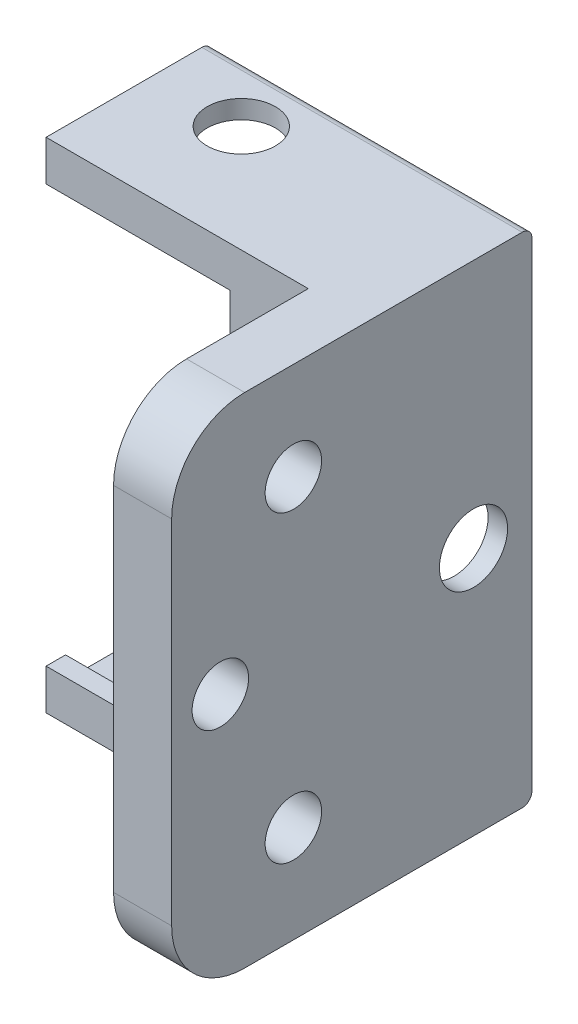
ISO-10303-21;
HEADER;
FILE_DESCRIPTION(('STEP AP214'),'2;1');
FILE_NAME('part.step','',(''),(''),'','','');
FILE_SCHEMA(('AUTOMOTIVE_DESIGN { 1 0 10303 214 1 1 1 1 }'));
ENDSEC;
DATA;
#1=APPLICATION_CONTEXT('core data for automotive mechanical design processes');
#2=APPLICATION_PROTOCOL_DEFINITION('international standard','automotive_design',2000,#1);
#3=PRODUCT_CONTEXT('',#1,'mechanical');
#4=PRODUCT('Part','Part','',(#3));
#5=PRODUCT_RELATED_PRODUCT_CATEGORY('part','',(#4));
#6=PRODUCT_DEFINITION_FORMATION('','',#4);
#7=PRODUCT_DEFINITION_CONTEXT('part definition',#1,'design');
#8=PRODUCT_DEFINITION('design','',#6,#7);
#9=PRODUCT_DEFINITION_SHAPE('','',#8);
#10=(LENGTH_UNIT() NAMED_UNIT(*) SI_UNIT(.MILLI.,.METRE.));
#11=(NAMED_UNIT(*) PLANE_ANGLE_UNIT() SI_UNIT($,.RADIAN.));
#12=(NAMED_UNIT(*) SI_UNIT($,.STERADIAN.) SOLID_ANGLE_UNIT());
#13=UNCERTAINTY_MEASURE_WITH_UNIT(LENGTH_MEASURE(1.E-05),#10,'distance_accuracy_value','');
#14=(GEOMETRIC_REPRESENTATION_CONTEXT(3) GLOBAL_UNCERTAINTY_ASSIGNED_CONTEXT((#13)) GLOBAL_UNIT_ASSIGNED_CONTEXT((#10,
#11,#12)) REPRESENTATION_CONTEXT('',''));
#15=CARTESIAN_POINT('',(0.,0.,0.));
#16=DIRECTION('',(0.,0.,1.));
#17=DIRECTION('',(1.,0.,0.));
#18=AXIS2_PLACEMENT_3D('',#15,#16,#17);
#19=CARTESIAN_POINT('',(0.,21.4398169336384,2.));
#20=DIRECTION('',(0.,-1.,0.));
#21=DIRECTION('',(0.,0.,-1.));
#22=AXIS2_PLACEMENT_3D('',#19,#20,#21);
#23=PLANE('',#22);
#24=DIRECTION('',(0.,0.,1.));
#25=VECTOR('',#24,1.);
#26=CARTESIAN_POINT('',(-9.0471071903977,21.4398169336384,2.));
#27=LINE('',#26,#25);
#28=CARTESIAN_POINT('',(-9.0471071903977,21.4398169336384,0.));
#29=VERTEX_POINT('',#28);
#30=CARTESIAN_POINT('',(-9.0471071903977,21.4398169336384,2.));
#31=VERTEX_POINT('',#30);
#32=EDGE_CURVE('E209',#29,#31,#27,.T.);
#33=ORIENTED_EDGE('',*,*,#32,.F.);
#34=DIRECTION('',(-1.,0.,0.));
#35=VECTOR('',#34,1.);
#36=CARTESIAN_POINT('',(0.,21.4398169336384,0.));
#37=LINE('',#36,#35);
#38=CARTESIAN_POINT('',(9.85000000000001,21.4398169336384,0.));
#39=VERTEX_POINT('',#38);
#40=EDGE_CURVE('E266',#39,#29,#37,.T.);
#41=ORIENTED_EDGE('',*,*,#40,.F.);
#42=DIRECTION('',(0.,0.,-1.));
#43=VECTOR('',#42,1.);
#44=CARTESIAN_POINT('',(9.85000000000001,21.4398169336384,2.));
#45=LINE('',#44,#43);
#46=CARTESIAN_POINT('',(9.85000000000001,21.4398169336384,2.));
#47=VERTEX_POINT('',#46);
#48=EDGE_CURVE('E286',#47,#39,#45,.T.);
#49=ORIENTED_EDGE('',*,*,#48,.F.);
#50=DIRECTION('',(-1.,0.,0.));
#51=VECTOR('',#50,1.);
#52=CARTESIAN_POINT('',(0.,21.4398169336384,2.));
#53=LINE('',#52,#51);
#54=EDGE_CURVE('E268',#47,#31,#53,.T.);
#55=ORIENTED_EDGE('',*,*,#54,.T.);
#56=EDGE_LOOP('',(#33,#41,#49,#55));
#57=FACE_BOUND('',#56,.T.);
#58=ADVANCED_FACE('F33',(#57),#23,.T.);
#59=CARTESIAN_POINT('',(9.85000000000001,0.,2.));
#60=DIRECTION('',(1.,0.,0.));
#61=DIRECTION('',(0.,1.,0.));
#62=AXIS2_PLACEMENT_3D('',#59,#60,#61);
#63=PLANE('',#62);
#64=DIRECTION('',(0.,-1.,0.));
#65=VECTOR('',#64,1.);
#66=CARTESIAN_POINT('',(9.85000000000001,0.,0.));
#67=LINE('',#66,#65);
#68=CARTESIAN_POINT('',(9.85000000000001,-21.4398169336385,0.));
#69=VERTEX_POINT('',#68);
#70=EDGE_CURVE('E278',#39,#69,#67,.T.);
#71=ORIENTED_EDGE('',*,*,#70,.T.);
#72=DIRECTION('',(0.,0.,-1.));
#73=VECTOR('',#72,1.);
#74=CARTESIAN_POINT('',(9.85000000000001,-21.4398169336385,2.));
#75=LINE('',#74,#73);
#76=CARTESIAN_POINT('',(9.85000000000001,-21.4398169336385,2.));
#77=VERTEX_POINT('',#76);
#78=EDGE_CURVE('E276',#77,#69,#75,.T.);
#79=ORIENTED_EDGE('',*,*,#78,.F.);
#80=DIRECTION('',(0.,-1.,0.));
#81=VECTOR('',#80,1.);
#82=CARTESIAN_POINT('',(9.85000000000001,0.,2.));
#83=LINE('',#82,#81);
#84=EDGE_CURVE('E271',#47,#77,#83,.T.);
#85=ORIENTED_EDGE('',*,*,#84,.F.);
#86=ORIENTED_EDGE('',*,*,#48,.T.);
#87=EDGE_LOOP('',(#71,#79,#85,#86));
#88=FACE_BOUND('',#87,.T.);
#89=ADVANCED_FACE('F394',(#88),#63,.F.);
#90=CARTESIAN_POINT('',(0.,-21.4398169336385,2.));
#91=DIRECTION('',(0.,-1.,0.));
#92=DIRECTION('',(0.,0.,-1.));
#93=AXIS2_PLACEMENT_3D('',#90,#91,#92);
#94=PLANE('',#93);
#95=DIRECTION('',(-1.,0.,0.));
#96=VECTOR('',#95,1.);
#97=CARTESIAN_POINT('',(0.,-21.4398169336385,0.));
#98=LINE('',#97,#96);
#99=CARTESIAN_POINT('',(-9.0471071903977,-21.4398169336385,0.));
#100=VERTEX_POINT('',#99);
#101=EDGE_CURVE('E280',#69,#100,#98,.T.);
#102=ORIENTED_EDGE('',*,*,#101,.T.);
#103=DIRECTION('',(0.,0.,1.));
#104=VECTOR('',#103,1.);
#105=CARTESIAN_POINT('',(-9.0471071903977,-21.4398169336385,2.));
#106=LINE('',#105,#104);
#107=CARTESIAN_POINT('',(-9.0471071903977,-21.4398169336385,2.));
#108=VERTEX_POINT('',#107);
#109=EDGE_CURVE('E212',#100,#108,#106,.T.);
#110=ORIENTED_EDGE('',*,*,#109,.T.);
#111=DIRECTION('',(-1.,0.,0.));
#112=VECTOR('',#111,1.);
#113=CARTESIAN_POINT('',(0.,-21.4398169336385,2.));
#114=LINE('',#113,#112);
#115=EDGE_CURVE('E273',#77,#108,#114,.T.);
#116=ORIENTED_EDGE('',*,*,#115,.F.);
#117=ORIENTED_EDGE('',*,*,#78,.T.);
#118=EDGE_LOOP('',(#102,#110,#116,#117));
#119=FACE_BOUND('',#118,.T.);
#120=ADVANCED_FACE('F389',(#119),#94,.F.);
#121=CARTESIAN_POINT('',(0.,0.,2.));
#122=DIRECTION('',(0.,0.,1.));
#123=DIRECTION('',(1.,0.,0.));
#124=AXIS2_PLACEMENT_3D('',#121,#122,#123);
#125=PLANE('',#124);
#126=DIRECTION('',(0.,1.,0.));
#127=VECTOR('',#126,1.);
#128=CARTESIAN_POINT('',(-9.0471071903977,25.6,2.));
#129=LINE('',#128,#127);
#130=CARTESIAN_POINT('',(-9.0471071903977,-25.6,2.));
#131=VERTEX_POINT('',#130);
#132=EDGE_CURVE('E198',#131,#108,#129,.T.);
#133=ORIENTED_EDGE('',*,*,#132,.F.);
#134=DIRECTION('',(1.,0.,0.));
#135=VECTOR('',#134,1.);
#136=CARTESIAN_POINT('',(-23.85,-25.6,2.));
#137=LINE('',#136,#135);
#138=CARTESIAN_POINT('',(17.8809566709219,-25.6,2.));
#139=VERTEX_POINT('',#138);
#140=EDGE_CURVE('E260',#131,#139,#137,.T.);
#141=ORIENTED_EDGE('',*,*,#140,.T.);
#142=DIRECTION('',(0.,-1.,0.));
#143=VECTOR('',#142,1.);
#144=CARTESIAN_POINT('',(17.8809566709219,-25.6,2.));
#145=LINE('',#144,#143);
#146=CARTESIAN_POINT('',(17.8809566709219,25.6,2.));
#147=VERTEX_POINT('',#146);
#148=EDGE_CURVE('E231',#147,#139,#145,.T.);
#149=ORIENTED_EDGE('',*,*,#148,.F.);
#150=DIRECTION('',(-1.,0.,0.));
#151=VECTOR('',#150,1.);
#152=CARTESIAN_POINT('',(23.85,25.6,2.));
#153=LINE('',#152,#151);
#154=CARTESIAN_POINT('',(-9.0471071903977,25.6,2.));
#155=VERTEX_POINT('',#154);
#156=EDGE_CURVE('E168',#147,#155,#153,.T.);
#157=ORIENTED_EDGE('',*,*,#156,.T.);
#158=EDGE_CURVE('E194',#31,#155,#129,.T.);
#159=ORIENTED_EDGE('',*,*,#158,.F.);
#160=ORIENTED_EDGE('',*,*,#54,.F.);
#161=ORIENTED_EDGE('',*,*,#84,.T.);
#162=ORIENTED_EDGE('',*,*,#115,.T.);
#163=EDGE_LOOP('',(#133,#141,#149,#157,#159,#160,#161,#162));
#164=FACE_BOUND('',#163,.T.);
#165=ADVANCED_FACE('F362',(#164),#125,.T.);
#166=CARTESIAN_POINT('',(0.,0.,0.));
#167=DIRECTION('',(0.,0.,1.));
#168=DIRECTION('',(1.,0.,0.));
#169=AXIS2_PLACEMENT_3D('',#166,#167,#168);
#170=PLANE('',#169);
#171=DIRECTION('',(0.,1.,0.));
#172=VECTOR('',#171,1.);
#173=CARTESIAN_POINT('',(21.85,0.,0.));
#174=LINE('',#173,#172);
#175=CARTESIAN_POINT('',(21.85,-23.7,0.));
#176=VERTEX_POINT('',#175);
#177=CARTESIAN_POINT('',(21.85,23.7,0.));
#178=VERTEX_POINT('',#177);
#179=EDGE_CURVE('E180',#176,#178,#174,.T.);
#180=ORIENTED_EDGE('',*,*,#179,.F.);
#181=DIRECTION('',(-1.,0.,0.));
#182=VECTOR('',#181,1.);
#183=CARTESIAN_POINT('',(-13.548634531605,-23.7,0.));
#184=LINE('',#183,#182);
#185=CARTESIAN_POINT('',(-9.0471071903977,-23.7,0.));
#186=VERTEX_POINT('',#185);
#187=EDGE_CURVE('E177',#176,#186,#184,.T.);
#188=ORIENTED_EDGE('',*,*,#187,.T.);
#189=DIRECTION('',(0.,1.,0.));
#190=VECTOR('',#189,1.);
#191=CARTESIAN_POINT('',(-9.0471071903977,0.,0.));
#192=LINE('',#191,#190);
#193=EDGE_CURVE('E210',#186,#100,#192,.T.);
#194=ORIENTED_EDGE('',*,*,#193,.T.);
#195=ORIENTED_EDGE('',*,*,#101,.F.);
#196=ORIENTED_EDGE('',*,*,#70,.F.);
#197=ORIENTED_EDGE('',*,*,#40,.T.);
#198=CARTESIAN_POINT('',(-9.0471071903977,23.7,0.));
#199=VERTEX_POINT('',#198);
#200=EDGE_CURVE('E55',#29,#199,#192,.T.);
#201=ORIENTED_EDGE('',*,*,#200,.T.);
#202=DIRECTION('',(1.,0.,0.));
#203=VECTOR('',#202,1.);
#204=CARTESIAN_POINT('',(-13.548634531605,23.7,0.));
#205=LINE('',#204,#203);
#206=EDGE_CURVE('E182',#199,#178,#205,.T.);
#207=ORIENTED_EDGE('',*,*,#206,.T.);
#208=EDGE_LOOP('',(#180,#188,#194,#195,#196,#197,#201,#207));
#209=FACE_BOUND('',#208,.T.);
#210=ADVANCED_FACE('F384',(#209),#170,.F.);
#211=CARTESIAN_POINT('',(21.85,-23.6,-15.));
#212=DIRECTION('',(1.,0.,0.));
#213=DIRECTION('',(0.,0.,-1.));
#214=AXIS2_PLACEMENT_3D('',#211,#212,#213);
#215=PLANE('',#214);
#216=CARTESIAN_POINT('',(21.85,0.,-9.));
#217=DIRECTION('',(1.,0.,0.));
#218=DIRECTION('',(0.,0.,-1.));
#219=AXIS2_PLACEMENT_3D('',#216,#217,#218);
#220=CIRCLE('',#219,3.49999999999999);
#221=CARTESIAN_POINT('',(21.85,0.,-12.5));
#222=VERTEX_POINT('',#221);
#223=EDGE_CURVE('E248',#222,#222,#220,.T.);
#224=ORIENTED_EDGE('',*,*,#223,.T.);
#225=EDGE_LOOP('',(#224));
#226=FACE_BOUND('',#225,.T.);
#227=DIRECTION('',(0.,1.,0.));
#228=VECTOR('',#227,1.);
#229=CARTESIAN_POINT('',(21.85,-23.6,-15.));
#230=LINE('',#229,#228);
#231=CARTESIAN_POINT('',(21.85,-23.7,-15.));
#232=VERTEX_POINT('',#231);
#233=CARTESIAN_POINT('',(21.85,23.7,-15.));
#234=VERTEX_POINT('',#233);
#235=EDGE_CURVE('E159',#232,#234,#230,.T.);
#236=ORIENTED_EDGE('',*,*,#235,.F.);
#237=DIRECTION('',(0.,0.,-1.));
#238=VECTOR('',#237,1.);
#239=CARTESIAN_POINT('',(21.85,-23.7,59.1593046502588));
#240=LINE('',#239,#238);
#241=EDGE_CURVE('E181',#176,#232,#240,.T.);
#242=ORIENTED_EDGE('',*,*,#241,.F.);
#243=ORIENTED_EDGE('',*,*,#179,.T.);
#244=DIRECTION('',(0.,0.,-1.));
#245=VECTOR('',#244,1.);
#246=CARTESIAN_POINT('',(21.85,23.7,59.1593046502588));
#247=LINE('',#246,#245);
#248=EDGE_CURVE('E175',#178,#234,#247,.T.);
#249=ORIENTED_EDGE('',*,*,#248,.T.);
#250=EDGE_LOOP('',(#236,#242,#243,#249));
#251=FACE_BOUND('',#250,.T.);
#252=ADVANCED_FACE('F179',(#226,#251),#215,.F.);
#253=CARTESIAN_POINT('',(23.85,25.6,-15.));
#254=DIRECTION('',(0.,1.,0.));
#255=DIRECTION('',(-1.,0.,0.));
#256=AXIS2_PLACEMENT_3D('',#253,#254,#255);
#257=PLANE('',#256);
#258=DIRECTION('',(0.,0.,1.));
#259=VECTOR('',#258,1.);
#260=CARTESIAN_POINT('',(-9.0471071903977,25.6,-15.));
#261=LINE('',#260,#259);
#262=CARTESIAN_POINT('',(-9.0471071903977,25.6,-14.));
#263=VERTEX_POINT('',#262);
#264=EDGE_CURVE('E200',#263,#155,#261,.T.);
#265=ORIENTED_EDGE('',*,*,#264,.T.);
#266=ORIENTED_EDGE('',*,*,#156,.F.);
#267=DIRECTION('',(0.,0.,-1.));
#268=VECTOR('',#267,1.);
#269=CARTESIAN_POINT('',(17.8809566709219,25.6,22.));
#270=LINE('',#269,#268);
#271=CARTESIAN_POINT('',(17.8809566709219,25.6,14.5));
#272=VERTEX_POINT('',#271);
#273=EDGE_CURVE('E243',#272,#147,#270,.T.);
#274=ORIENTED_EDGE('',*,*,#273,.F.);
#275=DIRECTION('',(-1.,0.,0.));
#276=VECTOR('',#275,1.);
#277=CARTESIAN_POINT('',(23.85,25.6,14.5));
#278=LINE('',#277,#276);
#279=CARTESIAN_POINT('',(23.85,25.6,14.5));
#280=VERTEX_POINT('',#279);
#281=EDGE_CURVE('E300',#272,#280,#278,.F.);
#282=ORIENTED_EDGE('',*,*,#281,.T.);
#283=DIRECTION('',(0.,0.,1.));
#284=VECTOR('',#283,1.);
#285=CARTESIAN_POINT('',(23.85,25.6,-15.));
#286=LINE('',#285,#284);
#287=CARTESIAN_POINT('',(23.85,25.6,-14.));
#288=VERTEX_POINT('',#287);
#289=EDGE_CURVE('E264',#288,#280,#286,.T.);
#290=ORIENTED_EDGE('',*,*,#289,.F.);
#291=DIRECTION('',(-1.,0.,0.));
#292=VECTOR('',#291,1.);
#293=CARTESIAN_POINT('',(-23.85,25.6,-14.));
#294=LINE('',#293,#292);
#295=EDGE_CURVE('E310',#288,#263,#294,.T.);
#296=ORIENTED_EDGE('',*,*,#295,.T.);
#297=EDGE_LOOP('',(#265,#266,#274,#282,#290,#296));
#298=FACE_BOUND('',#297,.T.);
#299=CARTESIAN_POINT('',(0.,25.6,-9.));
#300=DIRECTION('',(0.,-1.,0.));
#301=DIRECTION('',(0.,0.,-1.));
#302=AXIS2_PLACEMENT_3D('',#299,#300,#301);
#303=CIRCLE('',#302,3.49999999999999);
#304=CARTESIAN_POINT('',(0.,25.6,-12.5));
#305=VERTEX_POINT('',#304);
#306=EDGE_CURVE('E169',#305,#305,#303,.T.);
#307=ORIENTED_EDGE('',*,*,#306,.T.);
#308=EDGE_LOOP('',(#307));
#309=FACE_BOUND('',#308,.T.);
#310=ADVANCED_FACE('F342',(#298,#309),#257,.T.);
#311=CARTESIAN_POINT('',(23.85,-25.6,-15.));
#312=DIRECTION('',(1.,0.,0.));
#313=DIRECTION('',(0.,0.,-1.));
#314=AXIS2_PLACEMENT_3D('',#311,#312,#313);
#315=PLANE('',#314);
#316=CARTESIAN_POINT('',(23.85,-15.6,9.5));
#317=DIRECTION('',(1.,0.,0.));
#318=DIRECTION('',(0.,0.,-1.));
#319=AXIS2_PLACEMENT_3D('',#316,#317,#318);
#320=CIRCLE('',#319,2.9);
#321=CARTESIAN_POINT('',(23.85,-15.6,6.6));
#322=VERTEX_POINT('',#321);
#323=EDGE_CURVE('E215',#322,#322,#320,.T.);
#324=ORIENTED_EDGE('',*,*,#323,.F.);
#325=EDGE_LOOP('',(#324));
#326=FACE_BOUND('',#325,.T.);
#327=CARTESIAN_POINT('',(23.85,15.6,9.5));
#328=DIRECTION('',(1.,0.,0.));
#329=DIRECTION('',(0.,0.,-1.));
#330=AXIS2_PLACEMENT_3D('',#327,#328,#329);
#331=CIRCLE('',#330,2.9);
#332=CARTESIAN_POINT('',(23.85,15.6,6.6));
#333=VERTEX_POINT('',#332);
#334=EDGE_CURVE('E219',#333,#333,#331,.T.);
#335=ORIENTED_EDGE('',*,*,#334,.F.);
#336=EDGE_LOOP('',(#335));
#337=FACE_BOUND('',#336,.T.);
#338=CARTESIAN_POINT('',(23.85,0.,17.));
#339=DIRECTION('',(1.,0.,0.));
#340=DIRECTION('',(0.,0.,-1.));
#341=AXIS2_PLACEMENT_3D('',#338,#339,#340);
#342=CIRCLE('',#341,2.9);
#343=CARTESIAN_POINT('',(23.85,0.,14.1));
#344=VERTEX_POINT('',#343);
#345=EDGE_CURVE('E225',#344,#344,#342,.T.);
#346=ORIENTED_EDGE('',*,*,#345,.F.);
#347=EDGE_LOOP('',(#346));
#348=FACE_BOUND('',#347,.T.);
#349=CARTESIAN_POINT('',(23.85,0.,-9.));
#350=DIRECTION('',(1.,0.,0.));
#351=DIRECTION('',(0.,0.,-1.));
#352=AXIS2_PLACEMENT_3D('',#349,#350,#351);
#353=CIRCLE('',#352,3.49999999999999);
#354=CARTESIAN_POINT('',(23.85,0.,-12.5));
#355=VERTEX_POINT('',#354);
#356=EDGE_CURVE('E245',#355,#355,#353,.T.);
#357=ORIENTED_EDGE('',*,*,#356,.F.);
#358=EDGE_LOOP('',(#357));
#359=FACE_BOUND('',#358,.T.);
#360=DIRECTION('',(0.,1.,0.));
#361=VECTOR('',#360,1.);
#362=CARTESIAN_POINT('',(23.85,-25.6,-15.));
#363=LINE('',#362,#361);
#364=CARTESIAN_POINT('',(23.85,-24.6,-15.));
#365=VERTEX_POINT('',#364);
#366=CARTESIAN_POINT('',(23.85,24.6,-15.));
#367=VERTEX_POINT('',#366);
#368=EDGE_CURVE('E256',#365,#367,#363,.T.);
#369=ORIENTED_EDGE('',*,*,#368,.T.);
#370=CARTESIAN_POINT('',(23.85,24.6,-14.));
#371=DIRECTION('',(1.,0.,0.));
#372=DIRECTION('',(0.,0.,-1.));
#373=AXIS2_PLACEMENT_3D('',#370,#371,#372);
#374=CIRCLE('',#373,1.);
#375=EDGE_CURVE('E320',#367,#288,#374,.T.);
#376=ORIENTED_EDGE('',*,*,#375,.T.);
#377=ORIENTED_EDGE('',*,*,#289,.T.);
#378=CARTESIAN_POINT('',(23.85,18.1,14.5));
#379=DIRECTION('',(1.,0.,0.));
#380=DIRECTION('',(0.,0.,-1.));
#381=AXIS2_PLACEMENT_3D('',#378,#379,#380);
#382=CIRCLE('',#381,7.5);
#383=CARTESIAN_POINT('',(23.85,18.1,22.));
#384=VERTEX_POINT('',#383);
#385=EDGE_CURVE('E306',#280,#384,#382,.T.);
#386=ORIENTED_EDGE('',*,*,#385,.T.);
#387=DIRECTION('',(0.,1.,0.));
#388=VECTOR('',#387,1.);
#389=CARTESIAN_POINT('',(23.85,-25.6,22.));
#390=LINE('',#389,#388);
#391=CARTESIAN_POINT('',(23.85,-18.1,22.));
#392=VERTEX_POINT('',#391);
#393=EDGE_CURVE('E232',#392,#384,#390,.T.);
#394=ORIENTED_EDGE('',*,*,#393,.F.);
#395=CARTESIAN_POINT('',(23.85,-18.1,14.5));
#396=DIRECTION('',(1.,0.,0.));
#397=DIRECTION('',(0.,0.,-1.));
#398=AXIS2_PLACEMENT_3D('',#395,#396,#397);
#399=CIRCLE('',#398,7.5);
#400=CARTESIAN_POINT('',(23.85,-25.6,14.5));
#401=VERTEX_POINT('',#400);
#402=EDGE_CURVE('E303',#392,#401,#399,.T.);
#403=ORIENTED_EDGE('',*,*,#402,.T.);
#404=DIRECTION('',(0.,0.,1.));
#405=VECTOR('',#404,1.);
#406=CARTESIAN_POINT('',(23.85,-25.6,-15.));
#407=LINE('',#406,#405);
#408=CARTESIAN_POINT('',(23.85,-25.6,-14.));
#409=VERTEX_POINT('',#408);
#410=EDGE_CURVE('E259',#409,#401,#407,.T.);
#411=ORIENTED_EDGE('',*,*,#410,.F.);
#412=CARTESIAN_POINT('',(23.85,-24.6,-14.));
#413=DIRECTION('',(1.,0.,0.));
#414=DIRECTION('',(0.,0.,-1.));
#415=AXIS2_PLACEMENT_3D('',#412,#413,#414);
#416=CIRCLE('',#415,1.);
#417=EDGE_CURVE('E318',#409,#365,#416,.T.);
#418=ORIENTED_EDGE('',*,*,#417,.T.);
#419=EDGE_LOOP('',(#369,#376,#377,#386,#394,#403,#411,#418));
#420=FACE_BOUND('',#419,.T.);
#421=ADVANCED_FACE('F335',(#326,#337,#348,#359,#420),#315,.T.);
#422=CARTESIAN_POINT('',(-23.85,-25.6,-15.));
#423=DIRECTION('',(0.,-1.,0.));
#424=DIRECTION('',(1.,0.,0.));
#425=AXIS2_PLACEMENT_3D('',#422,#423,#424);
#426=PLANE('',#425);
#427=DIRECTION('',(0.,0.,1.));
#428=VECTOR('',#427,1.);
#429=CARTESIAN_POINT('',(-9.0471071903977,-25.6,-15.));
#430=LINE('',#429,#428);
#431=CARTESIAN_POINT('',(-9.0471071903977,-25.6,-14.));
#432=VERTEX_POINT('',#431);
#433=EDGE_CURVE('E204',#432,#131,#430,.T.);
#434=ORIENTED_EDGE('',*,*,#433,.F.);
#435=DIRECTION('',(1.,0.,0.));
#436=VECTOR('',#435,1.);
#437=CARTESIAN_POINT('',(23.85,-25.6,-14.));
#438=LINE('',#437,#436);
#439=EDGE_CURVE('E322',#432,#409,#438,.T.);
#440=ORIENTED_EDGE('',*,*,#439,.T.);
#441=ORIENTED_EDGE('',*,*,#410,.T.);
#442=DIRECTION('',(1.,0.,0.));
#443=VECTOR('',#442,1.);
#444=CARTESIAN_POINT('',(-23.85,-25.6,14.5));
#445=LINE('',#444,#443);
#446=CARTESIAN_POINT('',(17.8809566709219,-25.6,14.5));
#447=VERTEX_POINT('',#446);
#448=EDGE_CURVE('E308',#401,#447,#445,.F.);
#449=ORIENTED_EDGE('',*,*,#448,.T.);
#450=DIRECTION('',(0.,0.,-1.));
#451=VECTOR('',#450,1.);
#452=CARTESIAN_POINT('',(17.8809566709219,-25.6,22.));
#453=LINE('',#452,#451);
#454=EDGE_CURVE('E238',#447,#139,#453,.T.);
#455=ORIENTED_EDGE('',*,*,#454,.T.);
#456=ORIENTED_EDGE('',*,*,#140,.F.);
#457=EDGE_LOOP('',(#434,#440,#441,#449,#455,#456));
#458=FACE_BOUND('',#457,.T.);
#459=CARTESIAN_POINT('',(0.,-25.6,-9.));
#460=DIRECTION('',(0.,-1.,0.));
#461=DIRECTION('',(0.,0.,-1.));
#462=AXIS2_PLACEMENT_3D('',#459,#460,#461);
#463=CIRCLE('',#462,3.49999999999999);
#464=CARTESIAN_POINT('',(0.,-25.6,-12.5));
#465=VERTEX_POINT('',#464);
#466=EDGE_CURVE('E251',#465,#465,#463,.T.);
#467=ORIENTED_EDGE('',*,*,#466,.F.);
#468=EDGE_LOOP('',(#467));
#469=FACE_BOUND('',#468,.T.);
#470=ADVANCED_FACE('F372',(#458,#469),#426,.T.);
#471=CARTESIAN_POINT('',(0.,0.,-15.));
#472=DIRECTION('',(0.,0.,1.));
#473=DIRECTION('',(1.,0.,0.));
#474=AXIS2_PLACEMENT_3D('',#471,#472,#473);
#475=PLANE('',#474);
#476=DIRECTION('',(0.,1.,0.));
#477=VECTOR('',#476,1.);
#478=CARTESIAN_POINT('',(-9.0471071903977,25.6,-15.));
#479=LINE('',#478,#477);
#480=CARTESIAN_POINT('',(-9.0471071903977,-24.6,-15.));
#481=VERTEX_POINT('',#480);
#482=CARTESIAN_POINT('',(-9.0471071903977,-23.7,-15.));
#483=VERTEX_POINT('',#482);
#484=EDGE_CURVE('E197',#481,#483,#479,.T.);
#485=ORIENTED_EDGE('',*,*,#484,.T.);
#486=DIRECTION('',(-1.,0.,0.));
#487=VECTOR('',#486,1.);
#488=CARTESIAN_POINT('',(-13.548634531605,-23.7,-15.));
#489=LINE('',#488,#487);
#490=EDGE_CURVE('E48',#232,#483,#489,.T.);
#491=ORIENTED_EDGE('',*,*,#490,.F.);
#492=ORIENTED_EDGE('',*,*,#235,.T.);
#493=DIRECTION('',(1.,0.,0.));
#494=VECTOR('',#493,1.);
#495=CARTESIAN_POINT('',(-13.548634531605,23.7,-15.));
#496=LINE('',#495,#494);
#497=CARTESIAN_POINT('',(-9.0471071903977,23.7,-15.));
#498=VERTEX_POINT('',#497);
#499=EDGE_CURVE('E163',#498,#234,#496,.T.);
#500=ORIENTED_EDGE('',*,*,#499,.F.);
#501=CARTESIAN_POINT('',(-9.0471071903977,24.6,-15.));
#502=VERTEX_POINT('',#501);
#503=EDGE_CURVE('E195',#498,#502,#479,.T.);
#504=ORIENTED_EDGE('',*,*,#503,.T.);
#505=DIRECTION('',(-1.,0.,0.));
#506=VECTOR('',#505,1.);
#507=CARTESIAN_POINT('',(23.85,24.6,-15.));
#508=LINE('',#507,#506);
#509=EDGE_CURVE('E316',#502,#367,#508,.F.);
#510=ORIENTED_EDGE('',*,*,#509,.T.);
#511=ORIENTED_EDGE('',*,*,#368,.F.);
#512=DIRECTION('',(1.,0.,0.));
#513=VECTOR('',#512,1.);
#514=CARTESIAN_POINT('',(-23.85,-24.6,-15.));
#515=LINE('',#514,#513);
#516=EDGE_CURVE('E313',#365,#481,#515,.F.);
#517=ORIENTED_EDGE('',*,*,#516,.T.);
#518=EDGE_LOOP('',(#485,#491,#492,#500,#504,#510,#511,#517));
#519=FACE_BOUND('',#518,.T.);
#520=ADVANCED_FACE('F162',(#519),#475,.F.);
#521=CARTESIAN_POINT('',(0.,-25.6,-9.));
#522=DIRECTION('',(0.,-1.,0.));
#523=DIRECTION('',(0.,0.,-1.));
#524=AXIS2_PLACEMENT_3D('',#521,#522,#523);
#525=CYLINDRICAL_SURFACE('',#524,3.49999999999999);
#526=CARTESIAN_POINT('',(0.,-23.7,-9.));
#527=DIRECTION('',(0.,-1.,0.));
#528=DIRECTION('',(0.,0.,-1.));
#529=AXIS2_PLACEMENT_3D('',#526,#527,#528);
#530=CIRCLE('',#529,3.49999999999999);
#531=CARTESIAN_POINT('',(0.,-23.7,-12.5));
#532=VERTEX_POINT('',#531);
#533=EDGE_CURVE('E191',#532,#532,#530,.F.);
#534=ORIENTED_EDGE('',*,*,#533,.T.);
#535=EDGE_LOOP('',(#534));
#536=FACE_BOUND('',#535,.T.);
#537=ORIENTED_EDGE('',*,*,#466,.T.);
#538=EDGE_LOOP('',(#537));
#539=FACE_BOUND('',#538,.T.);
#540=ADVANCED_FACE('F446',(#536,#539),#525,.F.);
#541=CARTESIAN_POINT('',(0.,23.7,-9.));
#542=DIRECTION('',(0.,1.,0.));
#543=DIRECTION('',(-1.,0.,0.));
#544=AXIS2_PLACEMENT_3D('',#541,#542,#543);
#545=CIRCLE('',#544,3.49999999999999);
#546=CARTESIAN_POINT('',(-3.49999999999999,23.7,-9.));
#547=VERTEX_POINT('',#546);
#548=EDGE_CURVE('E184',#547,#547,#545,.F.);
#549=ORIENTED_EDGE('',*,*,#548,.T.);
#550=EDGE_LOOP('',(#549));
#551=FACE_BOUND('',#550,.T.);
#552=ORIENTED_EDGE('',*,*,#306,.F.);
#553=EDGE_LOOP('',(#552));
#554=FACE_BOUND('',#553,.T.);
#555=ADVANCED_FACE('F442',(#551,#554),#525,.F.);
#556=CARTESIAN_POINT('',(23.85,0.,-9.));
#557=DIRECTION('',(1.,0.,0.));
#558=DIRECTION('',(0.,0.,-1.));
#559=AXIS2_PLACEMENT_3D('',#556,#557,#558);
#560=CYLINDRICAL_SURFACE('',#559,3.49999999999999);
#561=ORIENTED_EDGE('',*,*,#356,.T.);
#562=EDGE_LOOP('',(#561));
#563=FACE_BOUND('',#562,.T.);
#564=ORIENTED_EDGE('',*,*,#223,.F.);
#565=EDGE_LOOP('',(#564));
#566=FACE_BOUND('',#565,.T.);
#567=ADVANCED_FACE('F438',(#563,#566),#560,.F.);
#568=CARTESIAN_POINT('',(17.8809566709219,-25.6,22.));
#569=DIRECTION('',(1.,0.,0.));
#570=DIRECTION('',(0.,0.,-1.));
#571=AXIS2_PLACEMENT_3D('',#568,#569,#570);
#572=PLANE('',#571);
#573=CARTESIAN_POINT('',(17.8809566709219,-15.6,9.5));
#574=DIRECTION('',(1.,0.,0.));
#575=DIRECTION('',(0.,0.,-1.));
#576=AXIS2_PLACEMENT_3D('',#573,#574,#575);
#577=CIRCLE('',#576,2.9);
#578=CARTESIAN_POINT('',(17.8809566709219,-15.6,6.6));
#579=VERTEX_POINT('',#578);
#580=EDGE_CURVE('E218',#579,#579,#577,.T.);
#581=ORIENTED_EDGE('',*,*,#580,.T.);
#582=EDGE_LOOP('',(#581));
#583=FACE_BOUND('',#582,.T.);
#584=CARTESIAN_POINT('',(17.8809566709219,15.6,9.5));
#585=DIRECTION('',(1.,0.,0.));
#586=DIRECTION('',(0.,0.,-1.));
#587=AXIS2_PLACEMENT_3D('',#584,#585,#586);
#588=CIRCLE('',#587,2.9);
#589=CARTESIAN_POINT('',(17.8809566709219,15.6,6.60000000000001));
#590=VERTEX_POINT('',#589);
#591=EDGE_CURVE('E222',#590,#590,#588,.T.);
#592=ORIENTED_EDGE('',*,*,#591,.T.);
#593=EDGE_LOOP('',(#592));
#594=FACE_BOUND('',#593,.T.);
#595=CARTESIAN_POINT('',(17.8809566709219,0.,17.));
#596=DIRECTION('',(1.,0.,0.));
#597=DIRECTION('',(0.,0.,-1.));
#598=AXIS2_PLACEMENT_3D('',#595,#596,#597);
#599=CIRCLE('',#598,2.9);
#600=CARTESIAN_POINT('',(17.8809566709219,0.,14.1));
#601=VERTEX_POINT('',#600);
#602=EDGE_CURVE('E228',#601,#601,#599,.T.);
#603=ORIENTED_EDGE('',*,*,#602,.T.);
#604=EDGE_LOOP('',(#603));
#605=FACE_BOUND('',#604,.T.);
#606=DIRECTION('',(0.,-1.,0.));
#607=VECTOR('',#606,1.);
#608=CARTESIAN_POINT('',(17.8809566709219,-25.6,22.));
#609=LINE('',#608,#607);
#610=CARTESIAN_POINT('',(17.8809566709219,18.1,22.));
#611=VERTEX_POINT('',#610);
#612=CARTESIAN_POINT('',(17.8809566709219,-18.1,22.));
#613=VERTEX_POINT('',#612);
#614=EDGE_CURVE('E235',#611,#613,#609,.T.);
#615=ORIENTED_EDGE('',*,*,#614,.F.);
#616=CARTESIAN_POINT('',(17.8809566709219,18.1,14.5));
#617=DIRECTION('',(1.,0.,0.));
#618=DIRECTION('',(0.,0.,-1.));
#619=AXIS2_PLACEMENT_3D('',#616,#617,#618);
#620=CIRCLE('',#619,7.5);
#621=EDGE_CURVE('E298',#611,#272,#620,.F.);
#622=ORIENTED_EDGE('',*,*,#621,.T.);
#623=ORIENTED_EDGE('',*,*,#273,.T.);
#624=ORIENTED_EDGE('',*,*,#148,.T.);
#625=ORIENTED_EDGE('',*,*,#454,.F.);
#626=CARTESIAN_POINT('',(17.8809566709219,-18.1,14.5));
#627=DIRECTION('',(1.,0.,0.));
#628=DIRECTION('',(0.,0.,-1.));
#629=AXIS2_PLACEMENT_3D('',#626,#627,#628);
#630=CIRCLE('',#629,7.5);
#631=EDGE_CURVE('E296',#447,#613,#630,.F.);
#632=ORIENTED_EDGE('',*,*,#631,.T.);
#633=EDGE_LOOP('',(#615,#622,#623,#624,#625,#632));
#634=FACE_BOUND('',#633,.T.);
#635=ADVANCED_FACE('F357',(#583,#594,#605,#634),#572,.F.);
#636=CARTESIAN_POINT('',(0.,0.,22.));
#637=DIRECTION('',(0.,0.,1.));
#638=DIRECTION('',(1.,0.,0.));
#639=AXIS2_PLACEMENT_3D('',#636,#637,#638);
#640=PLANE('',#639);
#641=ORIENTED_EDGE('',*,*,#393,.T.);
#642=DIRECTION('',(-1.,0.,0.));
#643=VECTOR('',#642,1.);
#644=CARTESIAN_POINT('',(0.,18.1,22.));
#645=LINE('',#644,#643);
#646=EDGE_CURVE('E293',#384,#611,#645,.T.);
#647=ORIENTED_EDGE('',*,*,#646,.T.);
#648=ORIENTED_EDGE('',*,*,#614,.T.);
#649=DIRECTION('',(1.,0.,0.));
#650=VECTOR('',#649,1.);
#651=CARTESIAN_POINT('',(0.,-18.1,22.));
#652=LINE('',#651,#650);
#653=EDGE_CURVE('E288',#613,#392,#652,.T.);
#654=ORIENTED_EDGE('',*,*,#653,.T.);
#655=EDGE_LOOP('',(#641,#647,#648,#654));
#656=FACE_BOUND('',#655,.T.);
#657=ADVANCED_FACE('F352',(#656),#640,.T.);
#658=CARTESIAN_POINT('',(23.85,0.,17.));
#659=DIRECTION('',(1.,0.,0.));
#660=DIRECTION('',(0.,0.,-1.));
#661=AXIS2_PLACEMENT_3D('',#658,#659,#660);
#662=CYLINDRICAL_SURFACE('',#661,2.9);
#663=ORIENTED_EDGE('',*,*,#345,.T.);
#664=EDGE_LOOP('',(#663));
#665=FACE_BOUND('',#664,.T.);
#666=ORIENTED_EDGE('',*,*,#602,.F.);
#667=EDGE_LOOP('',(#666));
#668=FACE_BOUND('',#667,.T.);
#669=ADVANCED_FACE('F429',(#665,#668),#662,.F.);
#670=CARTESIAN_POINT('',(23.85,15.6,9.5));
#671=DIRECTION('',(1.,0.,0.));
#672=DIRECTION('',(0.,0.,-1.));
#673=AXIS2_PLACEMENT_3D('',#670,#671,#672);
#674=CYLINDRICAL_SURFACE('',#673,2.9);
#675=ORIENTED_EDGE('',*,*,#334,.T.);
#676=EDGE_LOOP('',(#675));
#677=FACE_BOUND('',#676,.T.);
#678=ORIENTED_EDGE('',*,*,#591,.F.);
#679=EDGE_LOOP('',(#678));
#680=FACE_BOUND('',#679,.T.);
#681=ADVANCED_FACE('F425',(#677,#680),#674,.F.);
#682=CARTESIAN_POINT('',(23.85,-15.6,9.5));
#683=DIRECTION('',(1.,0.,0.));
#684=DIRECTION('',(0.,0.,-1.));
#685=AXIS2_PLACEMENT_3D('',#682,#683,#684);
#686=CYLINDRICAL_SURFACE('',#685,2.9);
#687=ORIENTED_EDGE('',*,*,#323,.T.);
#688=EDGE_LOOP('',(#687));
#689=FACE_BOUND('',#688,.T.);
#690=ORIENTED_EDGE('',*,*,#580,.F.);
#691=EDGE_LOOP('',(#690));
#692=FACE_BOUND('',#691,.T.);
#693=ADVANCED_FACE('F407',(#689,#692),#686,.F.);
#694=CARTESIAN_POINT('',(0.,18.1,14.5));
#695=DIRECTION('',(-1.,0.,0.));
#696=DIRECTION('',(0.,-1.,0.));
#697=AXIS2_PLACEMENT_3D('',#694,#695,#696);
#698=CYLINDRICAL_SURFACE('',#697,7.5);
#699=ORIENTED_EDGE('',*,*,#385,.F.);
#700=ORIENTED_EDGE('',*,*,#281,.F.);
#701=ORIENTED_EDGE('',*,*,#621,.F.);
#702=ORIENTED_EDGE('',*,*,#646,.F.);
#703=EDGE_LOOP('',(#699,#700,#701,#702));
#704=FACE_BOUND('',#703,.T.);
#705=ADVANCED_FACE('F355',(#704),#698,.T.);
#706=CARTESIAN_POINT('',(0.,-18.1,14.5));
#707=DIRECTION('',(1.,0.,0.));
#708=DIRECTION('',(0.,1.,0.));
#709=AXIS2_PLACEMENT_3D('',#706,#707,#708);
#710=CYLINDRICAL_SURFACE('',#709,7.5);
#711=ORIENTED_EDGE('',*,*,#631,.F.);
#712=ORIENTED_EDGE('',*,*,#448,.F.);
#713=ORIENTED_EDGE('',*,*,#402,.F.);
#714=ORIENTED_EDGE('',*,*,#653,.F.);
#715=EDGE_LOOP('',(#711,#712,#713,#714));
#716=FACE_BOUND('',#715,.T.);
#717=ADVANCED_FACE('F370',(#716),#710,.T.);
#718=CARTESIAN_POINT('',(23.85,24.6,-14.));
#719=DIRECTION('',(1.,0.,0.));
#720=DIRECTION('',(0.,1.,0.));
#721=AXIS2_PLACEMENT_3D('',#718,#719,#720);
#722=CYLINDRICAL_SURFACE('',#721,1.);
#723=CARTESIAN_POINT('',(-9.0471071903977,24.6,-14.));
#724=DIRECTION('',(1.,0.,0.));
#725=DIRECTION('',(0.,0.,-1.));
#726=AXIS2_PLACEMENT_3D('',#723,#724,#725);
#727=CIRCLE('',#726,1.);
#728=EDGE_CURVE('E203',#263,#502,#727,.F.);
#729=ORIENTED_EDGE('',*,*,#728,.F.);
#730=ORIENTED_EDGE('',*,*,#295,.F.);
#731=ORIENTED_EDGE('',*,*,#375,.F.);
#732=ORIENTED_EDGE('',*,*,#509,.F.);
#733=EDGE_LOOP('',(#729,#730,#731,#732));
#734=FACE_BOUND('',#733,.T.);
#735=ADVANCED_FACE('F340',(#734),#722,.T.);
#736=CARTESIAN_POINT('',(-23.85,-24.6,-14.));
#737=DIRECTION('',(-1.,0.,0.));
#738=DIRECTION('',(0.,-1.,0.));
#739=AXIS2_PLACEMENT_3D('',#736,#737,#738);
#740=CYLINDRICAL_SURFACE('',#739,1.);
#741=CARTESIAN_POINT('',(-9.0471071903977,-24.6,-14.));
#742=DIRECTION('',(1.,0.,0.));
#743=DIRECTION('',(0.,0.,-1.));
#744=AXIS2_PLACEMENT_3D('',#741,#742,#743);
#745=CIRCLE('',#744,1.);
#746=EDGE_CURVE('E324',#481,#432,#745,.F.);
#747=ORIENTED_EDGE('',*,*,#746,.F.);
#748=ORIENTED_EDGE('',*,*,#516,.F.);
#749=ORIENTED_EDGE('',*,*,#417,.F.);
#750=ORIENTED_EDGE('',*,*,#439,.F.);
#751=EDGE_LOOP('',(#747,#748,#749,#750));
#752=FACE_BOUND('',#751,.T.);
#753=ADVANCED_FACE('F35',(#752),#740,.T.);
#754=CARTESIAN_POINT('',(-9.0471071903977,25.6,-15.));
#755=DIRECTION('',(1.,0.,0.));
#756=DIRECTION('',(0.,0.,-1.));
#757=AXIS2_PLACEMENT_3D('',#754,#755,#756);
#758=PLANE('',#757);
#759=ORIENTED_EDGE('',*,*,#193,.F.);
#760=DIRECTION('',(0.,0.,-1.));
#761=VECTOR('',#760,1.);
#762=CARTESIAN_POINT('',(-9.0471071903977,-23.7,-15.));
#763=LINE('',#762,#761);
#764=EDGE_CURVE('E11',#186,#483,#763,.T.);
#765=ORIENTED_EDGE('',*,*,#764,.T.);
#766=ORIENTED_EDGE('',*,*,#484,.F.);
#767=ORIENTED_EDGE('',*,*,#746,.T.);
#768=ORIENTED_EDGE('',*,*,#433,.T.);
#769=ORIENTED_EDGE('',*,*,#132,.T.);
#770=ORIENTED_EDGE('',*,*,#109,.F.);
#771=EDGE_LOOP('',(#759,#765,#766,#767,#768,#769,#770));
#772=FACE_BOUND('',#771,.T.);
#773=ADVANCED_FACE('F378',(#772),#758,.F.);
#774=DIRECTION('',(0.,0.,1.));
#775=VECTOR('',#774,1.);
#776=CARTESIAN_POINT('',(-9.0471071903977,23.7,-15.));
#777=LINE('',#776,#775);
#778=EDGE_CURVE('E41',#498,#199,#777,.T.);
#779=ORIENTED_EDGE('',*,*,#778,.T.);
#780=ORIENTED_EDGE('',*,*,#200,.F.);
#781=ORIENTED_EDGE('',*,*,#32,.T.);
#782=ORIENTED_EDGE('',*,*,#158,.T.);
#783=ORIENTED_EDGE('',*,*,#264,.F.);
#784=ORIENTED_EDGE('',*,*,#728,.T.);
#785=ORIENTED_EDGE('',*,*,#503,.F.);
#786=EDGE_LOOP('',(#779,#780,#781,#782,#783,#784,#785));
#787=FACE_BOUND('',#786,.T.);
#788=ADVANCED_FACE('F326',(#787),#758,.F.);
#789=CARTESIAN_POINT('',(-13.548634531605,23.7,59.1593046502588));
#790=DIRECTION('',(0.,1.,0.));
#791=DIRECTION('',(-1.,0.,0.));
#792=AXIS2_PLACEMENT_3D('',#789,#790,#791);
#793=PLANE('',#792);
#794=ORIENTED_EDGE('',*,*,#499,.T.);
#795=ORIENTED_EDGE('',*,*,#248,.F.);
#796=ORIENTED_EDGE('',*,*,#206,.F.);
#797=ORIENTED_EDGE('',*,*,#778,.F.);
#798=EDGE_LOOP('',(#794,#795,#796,#797));
#799=FACE_BOUND('',#798,.T.);
#800=ORIENTED_EDGE('',*,*,#548,.F.);
#801=EDGE_LOOP('',(#800));
#802=FACE_BOUND('',#801,.T.);
#803=ADVANCED_FACE('F173',(#799,#802),#793,.F.);
#804=CARTESIAN_POINT('',(-13.548634531605,-23.7,59.1593046502588));
#805=DIRECTION('',(0.,-1.,0.));
#806=DIRECTION('',(0.,0.,-1.));
#807=AXIS2_PLACEMENT_3D('',#804,#805,#806);
#808=PLANE('',#807);
#809=ORIENTED_EDGE('',*,*,#187,.F.);
#810=ORIENTED_EDGE('',*,*,#241,.T.);
#811=ORIENTED_EDGE('',*,*,#490,.T.);
#812=ORIENTED_EDGE('',*,*,#764,.F.);
#813=EDGE_LOOP('',(#809,#810,#811,#812));
#814=FACE_BOUND('',#813,.T.);
#815=ORIENTED_EDGE('',*,*,#533,.F.);
#816=EDGE_LOOP('',(#815));
#817=FACE_BOUND('',#816,.T.);
#818=ADVANCED_FACE('F382',(#814,#817),#808,.F.);
#819=CLOSED_SHELL('',(#58,#89,#120,#165,#210,#252,#310,#421,#470,#520,#540,#555,#567,#635,#657,
#669,#681,#693,#705,#717,#735,#753,#773,#788,#803,#818));
#820=MANIFOLD_SOLID_BREP('B2',#819);
#821=ADVANCED_BREP_SHAPE_REPRESENTATION('',(#18,#820),#14);
#822=SHAPE_DEFINITION_REPRESENTATION(#9,#821);
ENDSEC;
END-ISO-10303-21;
